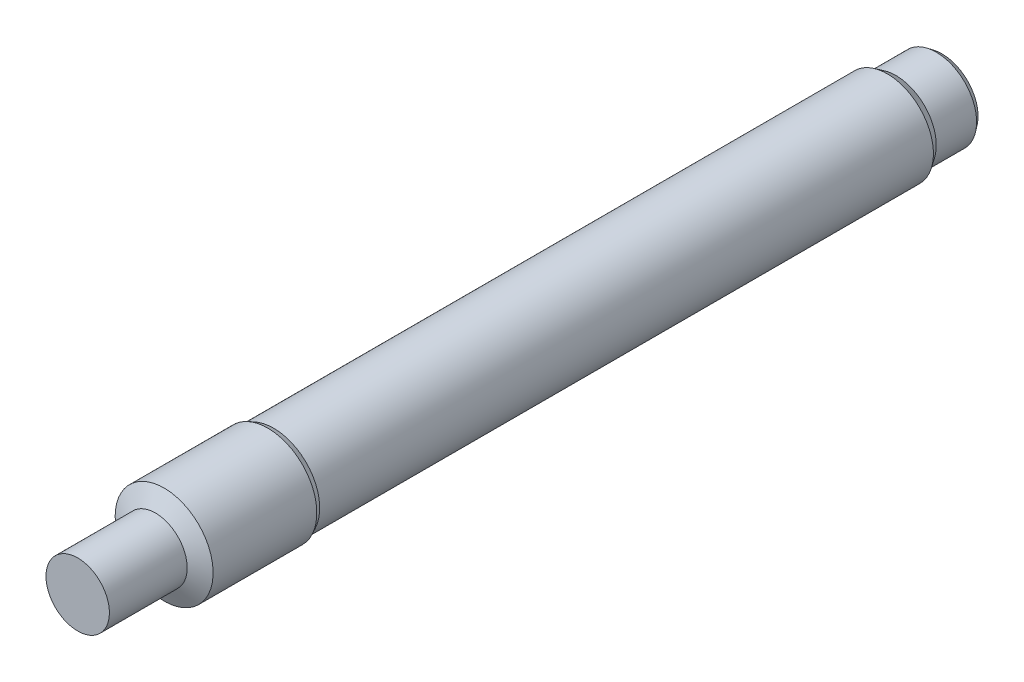
ISO-10303-21;
HEADER;
FILE_DESCRIPTION(('STEP AP214'),'2;1');
FILE_NAME('part.step','',(''),(''),'','','');
FILE_SCHEMA(('AUTOMOTIVE_DESIGN { 1 0 10303 214 1 1 1 1 }'));
ENDSEC;
DATA;
#1=APPLICATION_CONTEXT('core data for automotive mechanical design processes');
#2=APPLICATION_PROTOCOL_DEFINITION('international standard','automotive_design',2000,#1);
#3=PRODUCT_CONTEXT('',#1,'mechanical');
#4=PRODUCT('Part','Part','',(#3));
#5=PRODUCT_RELATED_PRODUCT_CATEGORY('part','',(#4));
#6=PRODUCT_DEFINITION_FORMATION('','',#4);
#7=PRODUCT_DEFINITION_CONTEXT('part definition',#1,'design');
#8=PRODUCT_DEFINITION('design','',#6,#7);
#9=PRODUCT_DEFINITION_SHAPE('','',#8);
#10=(LENGTH_UNIT() NAMED_UNIT(*) SI_UNIT(.MILLI.,.METRE.));
#11=(NAMED_UNIT(*) PLANE_ANGLE_UNIT() SI_UNIT($,.RADIAN.));
#12=(NAMED_UNIT(*) SI_UNIT($,.STERADIAN.) SOLID_ANGLE_UNIT());
#13=UNCERTAINTY_MEASURE_WITH_UNIT(LENGTH_MEASURE(1.E-05),#10,'distance_accuracy_value','');
#14=(GEOMETRIC_REPRESENTATION_CONTEXT(3) GLOBAL_UNCERTAINTY_ASSIGNED_CONTEXT((#13)) GLOBAL_UNIT_ASSIGNED_CONTEXT((#10,
#11,#12)) REPRESENTATION_CONTEXT('',''));
#15=CARTESIAN_POINT('',(0.,0.,0.));
#16=DIRECTION('',(0.,0.,1.));
#17=DIRECTION('',(1.,0.,0.));
#18=AXIS2_PLACEMENT_3D('',#15,#16,#17);
#19=CARTESIAN_POINT('',(11.,0.,300.));
#20=DIRECTION('',(0.,0.,-1.));
#21=DIRECTION('',(-1.,0.,0.));
#22=AXIS2_PLACEMENT_3D('',#19,#20,#21);
#23=PLANE('',#22);
#24=CARTESIAN_POINT('',(0.,0.,300.));
#25=DIRECTION('',(0.,0.,-1.));
#26=DIRECTION('',(-1.,0.,0.));
#27=AXIS2_PLACEMENT_3D('',#24,#25,#26);
#28=CIRCLE('',#27,11.);
#29=CARTESIAN_POINT('',(-11.,0.,300.));
#30=VERTEX_POINT('',#29);
#31=EDGE_CURVE('E68',#30,#30,#28,.T.);
#32=ORIENTED_EDGE('',*,*,#31,.F.);
#33=EDGE_LOOP('',(#32));
#34=FACE_BOUND('',#33,.T.);
#35=ADVANCED_FACE('F39',(#34),#23,.F.);
#36=CARTESIAN_POINT('',(0.,0.,0.));
#37=DIRECTION('',(0.,0.,1.));
#38=DIRECTION('',(1.,0.,0.));
#39=AXIS2_PLACEMENT_3D('',#36,#37,#38);
#40=PLANE('',#39);
#41=CARTESIAN_POINT('',(0.,0.,0.));
#42=DIRECTION('',(0.,0.,-1.));
#43=DIRECTION('',(-1.,0.,0.));
#44=AXIS2_PLACEMENT_3D('',#41,#42,#43);
#45=CIRCLE('',#44,12.5);
#46=CARTESIAN_POINT('',(-12.5,0.,0.));
#47=VERTEX_POINT('',#46);
#48=EDGE_CURVE('E10',#47,#47,#45,.T.);
#49=ORIENTED_EDGE('',*,*,#48,.T.);
#50=EDGE_LOOP('',(#49));
#51=FACE_BOUND('',#50,.T.);
#52=ADVANCED_FACE('F77',(#51),#40,.F.);
#53=CARTESIAN_POINT('',(0.,0.,2.));
#54=DIRECTION('',(0.,0.,1.));
#55=DIRECTION('',(1.,0.,0.));
#56=AXIS2_PLACEMENT_3D('',#53,#54,#55);
#57=CONICAL_SURFACE('',#56,14.,0.643501108793284);
#58=ORIENTED_EDGE('',*,*,#48,.F.);
#59=EDGE_LOOP('',(#58));
#60=FACE_BOUND('',#59,.T.);
#61=CARTESIAN_POINT('',(0.,0.,2.));
#62=DIRECTION('',(0.,0.,-1.));
#63=DIRECTION('',(-1.,0.,0.));
#64=AXIS2_PLACEMENT_3D('',#61,#62,#63);
#65=CIRCLE('',#64,14.);
#66=CARTESIAN_POINT('',(-14.,0.,2.));
#67=VERTEX_POINT('',#66);
#68=EDGE_CURVE('E44',#67,#67,#65,.T.);
#69=ORIENTED_EDGE('',*,*,#68,.T.);
#70=EDGE_LOOP('',(#69));
#71=FACE_BOUND('',#70,.T.);
#72=ADVANCED_FACE('F83',(#60,#71),#57,.T.);
#73=CARTESIAN_POINT('',(0.,0.,-5.));
#74=DIRECTION('',(0.,0.,-1.));
#75=DIRECTION('',(-1.,0.,0.));
#76=AXIS2_PLACEMENT_3D('',#73,#74,#75);
#77=CYLINDRICAL_SURFACE('',#76,14.);
#78=ORIENTED_EDGE('',*,*,#68,.F.);
#79=EDGE_LOOP('',(#78));
#80=FACE_BOUND('',#79,.T.);
#81=CARTESIAN_POINT('',(0.,0.,16.));
#82=DIRECTION('',(0.,0.,-1.));
#83=DIRECTION('',(-1.,0.,0.));
#84=AXIS2_PLACEMENT_3D('',#81,#82,#83);
#85=CIRCLE('',#84,14.);
#86=CARTESIAN_POINT('',(-14.,0.,16.));
#87=VERTEX_POINT('',#86);
#88=EDGE_CURVE('E47',#87,#87,#85,.T.);
#89=ORIENTED_EDGE('',*,*,#88,.T.);
#90=EDGE_LOOP('',(#89));
#91=FACE_BOUND('',#90,.T.);
#92=ADVANCED_FACE('F82',(#80,#91),#77,.T.);
#93=CARTESIAN_POINT('',(0.,0.,19.));
#94=DIRECTION('',(0.,0.,1.));
#95=DIRECTION('',(1.,0.,0.));
#96=AXIS2_PLACEMENT_3D('',#93,#94,#95);
#97=CONICAL_SURFACE('',#96,16.,0.588002603547568);
#98=ORIENTED_EDGE('',*,*,#88,.F.);
#99=EDGE_LOOP('',(#98));
#100=FACE_BOUND('',#99,.T.);
#101=CARTESIAN_POINT('',(0.,0.,19.));
#102=DIRECTION('',(0.,0.,-1.));
#103=DIRECTION('',(-1.,0.,0.));
#104=AXIS2_PLACEMENT_3D('',#101,#102,#103);
#105=CIRCLE('',#104,16.);
#106=CARTESIAN_POINT('',(-16.,0.,19.));
#107=VERTEX_POINT('',#106);
#108=EDGE_CURVE('E52',#107,#107,#105,.T.);
#109=ORIENTED_EDGE('',*,*,#108,.T.);
#110=EDGE_LOOP('',(#109));
#111=FACE_BOUND('',#110,.T.);
#112=ADVANCED_FACE('F91',(#100,#111),#97,.T.);
#113=CARTESIAN_POINT('',(0.,0.,-5.));
#114=DIRECTION('',(0.,0.,-1.));
#115=DIRECTION('',(-1.,0.,0.));
#116=AXIS2_PLACEMENT_3D('',#113,#114,#115);
#117=CYLINDRICAL_SURFACE('',#116,16.);
#118=ORIENTED_EDGE('',*,*,#108,.F.);
#119=EDGE_LOOP('',(#118));
#120=FACE_BOUND('',#119,.T.);
#121=CARTESIAN_POINT('',(0.,0.,232.));
#122=DIRECTION('',(0.,0.,-1.));
#123=DIRECTION('',(-1.,0.,0.));
#124=AXIS2_PLACEMENT_3D('',#121,#122,#123);
#125=CIRCLE('',#124,16.);
#126=CARTESIAN_POINT('',(-16.,0.,232.));
#127=VERTEX_POINT('',#126);
#128=EDGE_CURVE('E59',#127,#127,#125,.T.);
#129=ORIENTED_EDGE('',*,*,#128,.T.);
#130=EDGE_LOOP('',(#129));
#131=FACE_BOUND('',#130,.T.);
#132=ADVANCED_FACE('F94',(#120,#131),#117,.T.);
#133=CARTESIAN_POINT('',(0.,0.,234.));
#134=DIRECTION('',(0.,0.,1.));
#135=DIRECTION('',(1.,0.,0.));
#136=AXIS2_PLACEMENT_3D('',#133,#134,#135);
#137=CONICAL_SURFACE('',#136,17.,0.463647609000806);
#138=ORIENTED_EDGE('',*,*,#128,.F.);
#139=EDGE_LOOP('',(#138));
#140=FACE_BOUND('',#139,.T.);
#141=CARTESIAN_POINT('',(0.,0.,234.));
#142=DIRECTION('',(0.,0.,-1.));
#143=DIRECTION('',(-1.,0.,0.));
#144=AXIS2_PLACEMENT_3D('',#141,#142,#143);
#145=CIRCLE('',#144,17.);
#146=CARTESIAN_POINT('',(-17.,0.,234.));
#147=VERTEX_POINT('',#146);
#148=EDGE_CURVE('E62',#147,#147,#145,.T.);
#149=ORIENTED_EDGE('',*,*,#148,.T.);
#150=EDGE_LOOP('',(#149));
#151=FACE_BOUND('',#150,.T.);
#152=ADVANCED_FACE('F98',(#140,#151),#137,.T.);
#153=CARTESIAN_POINT('',(0.,0.,-5.));
#154=DIRECTION('',(0.,0.,-1.));
#155=DIRECTION('',(-1.,0.,0.));
#156=AXIS2_PLACEMENT_3D('',#153,#154,#155);
#157=CYLINDRICAL_SURFACE('',#156,17.);
#158=ORIENTED_EDGE('',*,*,#148,.F.);
#159=EDGE_LOOP('',(#158));
#160=FACE_BOUND('',#159,.T.);
#161=CARTESIAN_POINT('',(0.,0.,270.));
#162=DIRECTION('',(0.,0.,-1.));
#163=DIRECTION('',(-1.,0.,0.));
#164=AXIS2_PLACEMENT_3D('',#161,#162,#163);
#165=CIRCLE('',#164,17.);
#166=CARTESIAN_POINT('',(-17.,0.,270.));
#167=VERTEX_POINT('',#166);
#168=EDGE_CURVE('E64',#167,#167,#165,.T.);
#169=ORIENTED_EDGE('',*,*,#168,.T.);
#170=EDGE_LOOP('',(#169));
#171=FACE_BOUND('',#170,.T.);
#172=ADVANCED_FACE('F104',(#160,#171),#157,.T.);
#173=CARTESIAN_POINT('',(0.,0.,273.));
#174=DIRECTION('',(0.,0.,-1.));
#175=DIRECTION('',(-1.,0.,0.));
#176=AXIS2_PLACEMENT_3D('',#173,#174,#175);
#177=CONICAL_SURFACE('',#176,11.,1.10714871779409);
#178=ORIENTED_EDGE('',*,*,#168,.F.);
#179=EDGE_LOOP('',(#178));
#180=FACE_BOUND('',#179,.T.);
#181=CARTESIAN_POINT('',(0.,0.,273.));
#182=DIRECTION('',(0.,0.,-1.));
#183=DIRECTION('',(-1.,0.,0.));
#184=AXIS2_PLACEMENT_3D('',#181,#182,#183);
#185=CIRCLE('',#184,11.);
#186=CARTESIAN_POINT('',(-11.,0.,273.));
#187=VERTEX_POINT('',#186);
#188=EDGE_CURVE('E70',#187,#187,#185,.T.);
#189=ORIENTED_EDGE('',*,*,#188,.T.);
#190=EDGE_LOOP('',(#189));
#191=FACE_BOUND('',#190,.T.);
#192=ADVANCED_FACE('F110',(#180,#191),#177,.T.);
#193=CARTESIAN_POINT('',(0.,0.,-5.));
#194=DIRECTION('',(0.,0.,-1.));
#195=DIRECTION('',(-1.,0.,0.));
#196=AXIS2_PLACEMENT_3D('',#193,#194,#195);
#197=CYLINDRICAL_SURFACE('',#196,11.);
#198=ORIENTED_EDGE('',*,*,#188,.F.);
#199=EDGE_LOOP('',(#198));
#200=FACE_BOUND('',#199,.T.);
#201=ORIENTED_EDGE('',*,*,#31,.T.);
#202=EDGE_LOOP('',(#201));
#203=FACE_BOUND('',#202,.T.);
#204=ADVANCED_FACE('F74',(#200,#203),#197,.T.);
#205=CLOSED_SHELL('',(#35,#52,#72,#92,#112,#132,#152,#172,#192,#204));
#206=MANIFOLD_SOLID_BREP('B2',#205);
#207=ADVANCED_BREP_SHAPE_REPRESENTATION('',(#18,#206),#14);
#208=SHAPE_DEFINITION_REPRESENTATION(#9,#207);
ENDSEC;
END-ISO-10303-21;
